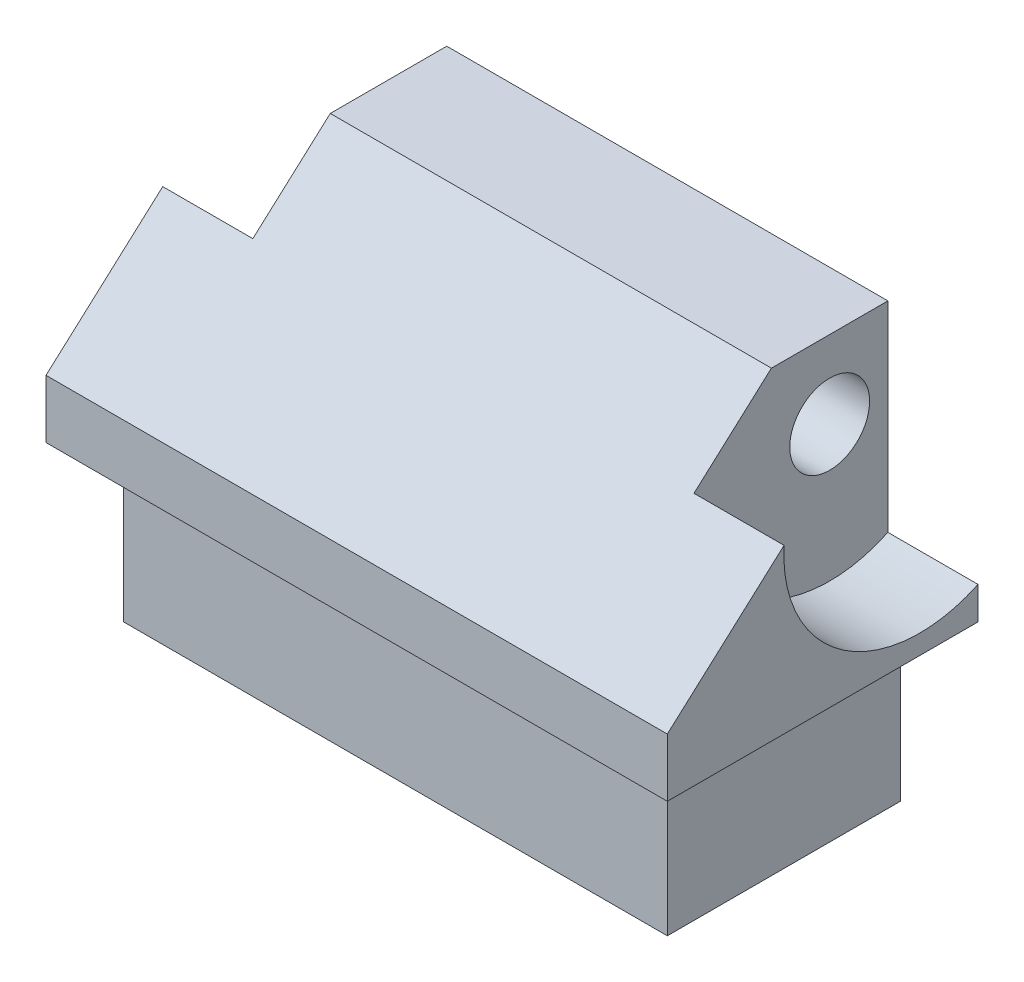
ISO-10303-21;
HEADER;
FILE_DESCRIPTION(('STEP AP214'),'2;1');
FILE_NAME('part.step','',(''),(''),'','','');
FILE_SCHEMA(('AUTOMOTIVE_DESIGN { 1 0 10303 214 1 1 1 1 }'));
ENDSEC;
DATA;
#1=APPLICATION_CONTEXT('core data for automotive mechanical design processes');
#2=APPLICATION_PROTOCOL_DEFINITION('international standard','automotive_design',2000,#1);
#3=PRODUCT_CONTEXT('',#1,'mechanical');
#4=PRODUCT('Part','Part','',(#3));
#5=PRODUCT_RELATED_PRODUCT_CATEGORY('part','',(#4));
#6=PRODUCT_DEFINITION_FORMATION('','',#4);
#7=PRODUCT_DEFINITION_CONTEXT('part definition',#1,'design');
#8=PRODUCT_DEFINITION('design','',#6,#7);
#9=PRODUCT_DEFINITION_SHAPE('','',#8);
#10=(LENGTH_UNIT() NAMED_UNIT(*) SI_UNIT(.MILLI.,.METRE.));
#11=(NAMED_UNIT(*) PLANE_ANGLE_UNIT() SI_UNIT($,.RADIAN.));
#12=(NAMED_UNIT(*) SI_UNIT($,.STERADIAN.) SOLID_ANGLE_UNIT());
#13=UNCERTAINTY_MEASURE_WITH_UNIT(LENGTH_MEASURE(1.E-05),#10,'distance_accuracy_value','');
#14=(GEOMETRIC_REPRESENTATION_CONTEXT(3) GLOBAL_UNCERTAINTY_ASSIGNED_CONTEXT((#13)) GLOBAL_UNIT_ASSIGNED_CONTEXT((#10,
#11,#12)) REPRESENTATION_CONTEXT('',''));
#15=CARTESIAN_POINT('',(0.,0.,0.));
#16=DIRECTION('',(0.,0.,1.));
#17=DIRECTION('',(1.,0.,0.));
#18=AXIS2_PLACEMENT_3D('',#15,#16,#17);
#19=CARTESIAN_POINT('',(25.4,19.05,-3.175));
#20=DIRECTION('',(0.,-1.,0.));
#21=DIRECTION('',(0.,0.,-1.));
#22=AXIS2_PLACEMENT_3D('',#19,#20,#21);
#23=PLANE('',#22);
#24=DIRECTION('',(0.,0.,-1.));
#25=VECTOR('',#24,1.);
#26=CARTESIAN_POINT('',(-18.034,19.05,-3.175));
#27=LINE('',#26,#25);
#28=CARTESIAN_POINT('',(-18.034,19.05,-3.175));
#29=VERTEX_POINT('',#28);
#30=CARTESIAN_POINT('',(-18.034,19.05,-12.7));
#31=VERTEX_POINT('',#30);
#32=EDGE_CURVE('E222',#29,#31,#27,.T.);
#33=ORIENTED_EDGE('',*,*,#32,.F.);
#34=DIRECTION('',(-1.,0.,0.));
#35=VECTOR('',#34,1.);
#36=CARTESIAN_POINT('',(25.4,19.05,-3.175));
#37=LINE('',#36,#35);
#38=CARTESIAN_POINT('',(18.034,19.05,-3.175));
#39=VERTEX_POINT('',#38);
#40=EDGE_CURVE('E159',#39,#29,#37,.T.);
#41=ORIENTED_EDGE('',*,*,#40,.F.);
#42=DIRECTION('',(0.,0.,1.));
#43=VECTOR('',#42,1.);
#44=CARTESIAN_POINT('',(18.034,19.05,-3.175));
#45=LINE('',#44,#43);
#46=CARTESIAN_POINT('',(18.034,19.05,-12.7));
#47=VERTEX_POINT('',#46);
#48=EDGE_CURVE('E56',#47,#39,#45,.T.);
#49=ORIENTED_EDGE('',*,*,#48,.F.);
#50=DIRECTION('',(-1.,0.,0.));
#51=VECTOR('',#50,1.);
#52=CARTESIAN_POINT('',(25.4,19.05,-12.7));
#53=LINE('',#52,#51);
#54=EDGE_CURVE('E161',#47,#31,#53,.T.);
#55=ORIENTED_EDGE('',*,*,#54,.T.);
#56=EDGE_LOOP('',(#33,#41,#49,#55));
#57=FACE_BOUND('',#56,.T.);
#58=ADVANCED_FACE('F34',(#57),#23,.F.);
#59=CARTESIAN_POINT('',(25.4,3.175,-12.7));
#60=DIRECTION('',(0.,0.,1.));
#61=DIRECTION('',(1.,0.,0.));
#62=AXIS2_PLACEMENT_3D('',#59,#60,#61);
#63=PLANE('',#62);
#64=DIRECTION('',(-1.,0.,0.));
#65=VECTOR('',#64,1.);
#66=CARTESIAN_POINT('',(-18.034,2.6597684289654,-12.7));
#67=LINE('',#66,#65);
#68=CARTESIAN_POINT('',(-18.034,2.6597684289654,-12.7));
#69=VERTEX_POINT('',#68);
#70=CARTESIAN_POINT('',(-25.4,2.6597684289654,-12.7));
#71=VERTEX_POINT('',#70);
#72=EDGE_CURVE('E132',#69,#71,#67,.T.);
#73=ORIENTED_EDGE('',*,*,#72,.F.);
#74=DIRECTION('',(0.,-1.,0.));
#75=VECTOR('',#74,1.);
#76=CARTESIAN_POINT('',(-18.034,3.175,-12.7));
#77=LINE('',#76,#75);
#78=EDGE_CURVE('E227',#31,#69,#77,.T.);
#79=ORIENTED_EDGE('',*,*,#78,.F.);
#80=ORIENTED_EDGE('',*,*,#54,.F.);
#81=DIRECTION('',(0.,1.,0.));
#82=VECTOR('',#81,1.);
#83=CARTESIAN_POINT('',(18.034,3.175,-12.7));
#84=LINE('',#83,#82);
#85=CARTESIAN_POINT('',(18.034,2.6597684289654,-12.7));
#86=VERTEX_POINT('',#85);
#87=EDGE_CURVE('E155',#86,#47,#84,.T.);
#88=ORIENTED_EDGE('',*,*,#87,.F.);
#89=DIRECTION('',(1.,0.,0.));
#90=VECTOR('',#89,1.);
#91=CARTESIAN_POINT('',(18.034,2.6597684289654,-12.7));
#92=LINE('',#91,#90);
#93=CARTESIAN_POINT('',(25.4,2.6597684289654,-12.7));
#94=VERTEX_POINT('',#93);
#95=EDGE_CURVE('E150',#86,#94,#92,.T.);
#96=ORIENTED_EDGE('',*,*,#95,.T.);
#97=DIRECTION('',(0.,-1.,0.));
#98=VECTOR('',#97,1.);
#99=CARTESIAN_POINT('',(25.4,3.175,-12.7));
#100=LINE('',#99,#98);
#101=CARTESIAN_POINT('',(25.4,0.,-12.7));
#102=VERTEX_POINT('',#101);
#103=EDGE_CURVE('E176',#94,#102,#100,.T.);
#104=ORIENTED_EDGE('',*,*,#103,.T.);
#105=DIRECTION('',(-1.,0.,0.));
#106=VECTOR('',#105,1.);
#107=CARTESIAN_POINT('',(25.4,0.,-12.7));
#108=LINE('',#107,#106);
#109=CARTESIAN_POINT('',(-25.4,0.,-12.7));
#110=VERTEX_POINT('',#109);
#111=EDGE_CURVE('E171',#102,#110,#108,.T.);
#112=ORIENTED_EDGE('',*,*,#111,.T.);
#113=DIRECTION('',(0.,-1.,0.));
#114=VECTOR('',#113,1.);
#115=CARTESIAN_POINT('',(-25.4,3.175,-12.7));
#116=LINE('',#115,#114);
#117=EDGE_CURVE('E174',#71,#110,#116,.T.);
#118=ORIENTED_EDGE('',*,*,#117,.F.);
#119=EDGE_LOOP('',(#73,#79,#80,#88,#96,#104,#112,#118));
#120=FACE_BOUND('',#119,.T.);
#121=ADVANCED_FACE('F248',(#120),#63,.F.);
#122=CARTESIAN_POINT('',(25.4,4.7625,12.7));
#123=DIRECTION('',(0.,-0.743294146247166,-0.66896473162245));
#124=DIRECTION('',(0.,0.66896473162245,-0.743294146247166));
#125=AXIS2_PLACEMENT_3D('',#122,#123,#124);
#126=PLANE('',#125);
#127=DIRECTION('',(-1.,0.,0.));
#128=VECTOR('',#127,1.);
#129=CARTESIAN_POINT('',(-18.034,13.3522422156945,3.15584198256169));
#130=LINE('',#129,#128);
#131=CARTESIAN_POINT('',(-25.4,13.3522422156945,3.1558419825617));
#132=VERTEX_POINT('',#131);
#133=CARTESIAN_POINT('',(-18.034,13.3522422156945,3.1558419825617));
#134=VERTEX_POINT('',#133);
#135=EDGE_CURVE('E11',#132,#134,#130,.F.);
#136=ORIENTED_EDGE('',*,*,#135,.F.);
#137=DIRECTION('',(0.,-0.66896473162245,0.743294146247166));
#138=VECTOR('',#137,1.);
#139=CARTESIAN_POINT('',(-25.4,4.7625,12.7));
#140=LINE('',#139,#138);
#141=CARTESIAN_POINT('',(-25.4,4.7625,12.7));
#142=VERTEX_POINT('',#141);
#143=EDGE_CURVE('E140',#132,#142,#140,.T.);
#144=ORIENTED_EDGE('',*,*,#143,.T.);
#145=DIRECTION('',(-1.,0.,0.));
#146=VECTOR('',#145,1.);
#147=CARTESIAN_POINT('',(25.4,4.7625,12.7));
#148=LINE('',#147,#146);
#149=CARTESIAN_POINT('',(25.4,4.7625,12.7));
#150=VERTEX_POINT('',#149);
#151=EDGE_CURVE('E152',#150,#142,#148,.T.);
#152=ORIENTED_EDGE('',*,*,#151,.F.);
#153=DIRECTION('',(0.,-0.66896473162245,0.743294146247166));
#154=VECTOR('',#153,1.);
#155=CARTESIAN_POINT('',(25.4,4.7625,12.7));
#156=LINE('',#155,#154);
#157=CARTESIAN_POINT('',(25.4,13.3522422156945,3.1558419825617));
#158=VERTEX_POINT('',#157);
#159=EDGE_CURVE('E149',#158,#150,#156,.T.);
#160=ORIENTED_EDGE('',*,*,#159,.F.);
#161=DIRECTION('',(1.,0.,0.));
#162=VECTOR('',#161,1.);
#163=CARTESIAN_POINT('',(18.034,13.3522422156945,3.15584198256169));
#164=LINE('',#163,#162);
#165=CARTESIAN_POINT('',(18.034,13.3522422156945,3.1558419825617));
#166=VERTEX_POINT('',#165);
#167=EDGE_CURVE('E42',#158,#166,#164,.F.);
#168=ORIENTED_EDGE('',*,*,#167,.T.);
#169=DIRECTION('',(0.,-0.66896473162245,0.743294146247166));
#170=VECTOR('',#169,1.);
#171=CARTESIAN_POINT('',(18.034,4.7625,12.7));
#172=LINE('',#171,#170);
#173=EDGE_CURVE('E210',#39,#166,#172,.T.);
#174=ORIENTED_EDGE('',*,*,#173,.F.);
#175=ORIENTED_EDGE('',*,*,#40,.T.);
#176=DIRECTION('',(0.,0.66896473162245,-0.743294146247166));
#177=VECTOR('',#176,1.);
#178=CARTESIAN_POINT('',(-18.034,4.7625,12.7));
#179=LINE('',#178,#177);
#180=EDGE_CURVE('E143',#134,#29,#179,.T.);
#181=ORIENTED_EDGE('',*,*,#180,.F.);
#182=EDGE_LOOP('',(#136,#144,#152,#160,#168,#174,#175,#181));
#183=FACE_BOUND('',#182,.T.);
#184=ADVANCED_FACE('F138',(#183),#126,.F.);
#185=CARTESIAN_POINT('',(-25.4,12.7,-7.9375));
#186=DIRECTION('',(1.,0.,0.));
#187=DIRECTION('',(0.,0.,-1.));
#188=AXIS2_PLACEMENT_3D('',#185,#186,#187);
#189=CYLINDRICAL_SURFACE('',#188,3.2639);
#190=CARTESIAN_POINT('',(18.034,12.7,-7.9375));
#191=DIRECTION('',(1.,0.,0.));
#192=DIRECTION('',(0.,0.,-1.));
#193=AXIS2_PLACEMENT_3D('',#190,#191,#192);
#194=CIRCLE('',#193,3.2639);
#195=CARTESIAN_POINT('',(18.034,12.7,-11.2014));
#196=VERTEX_POINT('',#195);
#197=EDGE_CURVE('E230',#196,#196,#194,.T.);
#198=CARTESIAN_POINT('',(-18.034,12.7,-7.9375));
#199=DIRECTION('',(-1.,0.,0.));
#200=DIRECTION('',(0.,0.,1.));
#201=AXIS2_PLACEMENT_3D('',#198,#199,#200);
#202=CIRCLE('',#201,3.2639);
#203=CARTESIAN_POINT('',(-18.034,12.7,-11.2014));
#204=VERTEX_POINT('',#203);
#205=EDGE_CURVE('E218',#204,#204,#202,.F.);
#206=CARTESIAN_POINT('',(18.034,12.7,-11.2014));
#207=CARTESIAN_POINT('',(17.6582916666667,12.7,-11.2014));
#208=CARTESIAN_POINT('',(17.2825833333333,12.7,-11.2014));
#209=CARTESIAN_POINT('',(16.5311666666667,12.7,-11.2014));
#210=CARTESIAN_POINT('',(16.1554583333333,12.7,-11.2014));
#211=CARTESIAN_POINT('',(15.4040416666667,12.7,-11.2014));
#212=CARTESIAN_POINT('',(15.0283333333333,12.7,-11.2014));
#213=CARTESIAN_POINT('',(14.2769166666667,12.7,-11.2014));
#214=CARTESIAN_POINT('',(13.9012083333333,12.7,-11.2014));
#215=CARTESIAN_POINT('',(13.1497916666667,12.7,-11.2014));
#216=CARTESIAN_POINT('',(12.7740833333333,12.7,-11.2014));
#217=CARTESIAN_POINT('',(12.0226666666667,12.7,-11.2014));
#218=CARTESIAN_POINT('',(11.6469583333333,12.7,-11.2014));
#219=CARTESIAN_POINT('',(10.8955416666667,12.7,-11.2014));
#220=CARTESIAN_POINT('',(10.5198333333333,12.7,-11.2014));
#221=CARTESIAN_POINT('',(9.76841666666666,12.7,-11.2014));
#222=CARTESIAN_POINT('',(9.39270833333333,12.7,-11.2014));
#223=CARTESIAN_POINT('',(8.64129166666666,12.7,-11.2014));
#224=CARTESIAN_POINT('',(8.26558333333333,12.7,-11.2014));
#225=CARTESIAN_POINT('',(7.51416666666666,12.7,-11.2014));
#226=CARTESIAN_POINT('',(7.13845833333333,12.7,-11.2014));
#227=CARTESIAN_POINT('',(6.38704166666666,12.7,-11.2014));
#228=CARTESIAN_POINT('',(6.01133333333333,12.7,-11.2014));
#229=CARTESIAN_POINT('',(5.25991666666666,12.7,-11.2014));
#230=CARTESIAN_POINT('',(4.88420833333333,12.7,-11.2014));
#231=CARTESIAN_POINT('',(4.13279166666666,12.7,-11.2014));
#232=CARTESIAN_POINT('',(3.75708333333333,12.7,-11.2014));
#233=CARTESIAN_POINT('',(3.00566666666666,12.7,-11.2014));
#234=CARTESIAN_POINT('',(2.62995833333333,12.7,-11.2014));
#235=CARTESIAN_POINT('',(1.87854166666666,12.7,-11.2014));
#236=CARTESIAN_POINT('',(1.50283333333333,12.7,-11.2014));
#237=CARTESIAN_POINT('',(0.751416666666663,12.7,-11.2014));
#238=CARTESIAN_POINT('',(0.37570833333333,12.7,-11.2014));
#239=CARTESIAN_POINT('',(-0.375708333333337,12.7,-11.2014));
#240=CARTESIAN_POINT('',(-0.75141666666667,12.7,-11.2014));
#241=CARTESIAN_POINT('',(-1.50283333333334,12.7,-11.2014));
#242=CARTESIAN_POINT('',(-1.87854166666667,12.7,-11.2014));
#243=CARTESIAN_POINT('',(-2.62995833333334,12.7,-11.2014));
#244=CARTESIAN_POINT('',(-3.00566666666667,12.7,-11.2014));
#245=CARTESIAN_POINT('',(-3.75708333333334,12.7,-11.2014));
#246=CARTESIAN_POINT('',(-4.13279166666667,12.7,-11.2014));
#247=CARTESIAN_POINT('',(-4.88420833333334,12.7,-11.2014));
#248=CARTESIAN_POINT('',(-5.25991666666667,12.7,-11.2014));
#249=CARTESIAN_POINT('',(-6.01133333333334,12.7,-11.2014));
#250=CARTESIAN_POINT('',(-6.38704166666667,12.7,-11.2014));
#251=CARTESIAN_POINT('',(-7.13845833333334,12.7,-11.2014));
#252=CARTESIAN_POINT('',(-7.51416666666667,12.7,-11.2014));
#253=CARTESIAN_POINT('',(-8.26558333333334,12.7,-11.2014));
#254=CARTESIAN_POINT('',(-8.64129166666667,12.7,-11.2014));
#255=CARTESIAN_POINT('',(-9.39270833333334,12.7,-11.2014));
#256=CARTESIAN_POINT('',(-9.76841666666667,12.7,-11.2014));
#257=CARTESIAN_POINT('',(-10.5198333333333,12.7,-11.2014));
#258=CARTESIAN_POINT('',(-10.8955416666667,12.7,-11.2014));
#259=CARTESIAN_POINT('',(-11.6469583333333,12.7,-11.2014));
#260=CARTESIAN_POINT('',(-12.0226666666667,12.7,-11.2014));
#261=CARTESIAN_POINT('',(-12.7740833333333,12.7,-11.2014));
#262=CARTESIAN_POINT('',(-13.1497916666667,12.7,-11.2014));
#263=CARTESIAN_POINT('',(-13.9012083333333,12.7,-11.2014));
#264=CARTESIAN_POINT('',(-14.2769166666667,12.7,-11.2014));
#265=CARTESIAN_POINT('',(-15.0283333333333,12.7,-11.2014));
#266=CARTESIAN_POINT('',(-15.4040416666667,12.7,-11.2014));
#267=CARTESIAN_POINT('',(-16.1554583333333,12.7,-11.2014));
#268=CARTESIAN_POINT('',(-16.5311666666667,12.7,-11.2014));
#269=CARTESIAN_POINT('',(-17.2825833333333,12.7,-11.2014));
#270=CARTESIAN_POINT('',(-17.6582916666667,12.7,-11.2014));
#271=CARTESIAN_POINT('',(-18.034,12.7,-11.2014));
#272=B_SPLINE_CURVE_WITH_KNOTS('',3,(#206,#207,#208,#209,#210,#211,#212,#213,#214,#215,#216,
#217,#218,#219,#220,#221,#222,#223,#224,#225,#226,#227,#228,#229,#230,#231,#232,#233,#234,#235,
#236,#237,#238,#239,#240,#241,#242,#243,#244,#245,#246,#247,#248,#249,#250,#251,#252,#253,#254,
#255,#256,#257,#258,#259,#260,#261,#262,#263,#264,#265,#266,#267,#268,#269,#270,#271),
.UNSPECIFIED.,.F.,.F.,(4,2,2,2,2,2,2,2,2,2,2,2,2,2,2,2,2,2,2,2,2,2,2,2,2,2,2,2,2,2,2,2,4),(0.,
1.127125,2.25425,3.381375,4.5085,5.635625,6.76275,7.889875,9.017,10.144125,11.27125,12.398375,
13.5255,14.652625,15.77975,16.906875,18.034,19.161125,20.28825,21.415375,22.5425,23.669625,
24.79675,25.923875,27.051,28.178125,29.30525,30.432375,31.5595,32.686625,33.81375,34.940875,
36.068),.UNSPECIFIED.);
#273=EDGE_CURVE('BSEAM330',#196,#204,#272,.T.);
#274=ORIENTED_EDGE('',*,*,#197,.T.);
#275=ORIENTED_EDGE('',*,*,#205,.F.);
#276=ORIENTED_EDGE('',*,*,#273,.T.);
#277=ORIENTED_EDGE('',*,*,#273,.F.);
#278=EDGE_LOOP('',(#274,#276,#275,#277));
#279=FACE_BOUND('',#278,.T.);
#280=ADVANCED_FACE('F330',(#279),#189,.F.);
#281=CARTESIAN_POINT('',(-22.225,-12.7,9.52500000000001));
#282=DIRECTION('',(-1.,0.,0.));
#283=DIRECTION('',(0.,0.,1.));
#284=AXIS2_PLACEMENT_3D('',#281,#282,#283);
#285=PLANE('',#284);
#286=DIRECTION('',(0.,0.,1.));
#287=VECTOR('',#286,1.);
#288=CARTESIAN_POINT('',(-22.225,0.,9.52500000000001));
#289=LINE('',#288,#287);
#290=CARTESIAN_POINT('',(-22.225,0.,-9.52499999999999));
#291=VERTEX_POINT('',#290);
#292=CARTESIAN_POINT('',(-22.225,0.,9.52500000000001));
#293=VERTEX_POINT('',#292);
#294=EDGE_CURVE('E182',#291,#293,#289,.T.);
#295=ORIENTED_EDGE('',*,*,#294,.F.);
#296=DIRECTION('',(0.,1.,0.));
#297=VECTOR('',#296,1.);
#298=CARTESIAN_POINT('',(-22.225,-12.7,-9.52499999999999));
#299=LINE('',#298,#297);
#300=CARTESIAN_POINT('',(-22.225,-12.7,-9.52499999999999));
#301=VERTEX_POINT('',#300);
#302=EDGE_CURVE('E207',#301,#291,#299,.T.);
#303=ORIENTED_EDGE('',*,*,#302,.F.);
#304=DIRECTION('',(0.,0.,1.));
#305=VECTOR('',#304,1.);
#306=CARTESIAN_POINT('',(-22.225,-12.7,9.52500000000001));
#307=LINE('',#306,#305);
#308=CARTESIAN_POINT('',(-22.225,-12.7,9.52500000000001));
#309=VERTEX_POINT('',#308);
#310=EDGE_CURVE('E183',#301,#309,#307,.T.);
#311=ORIENTED_EDGE('',*,*,#310,.T.);
#312=DIRECTION('',(0.,1.,0.));
#313=VECTOR('',#312,1.);
#314=CARTESIAN_POINT('',(-22.225,-12.7,9.52500000000001));
#315=LINE('',#314,#313);
#316=EDGE_CURVE('E196',#309,#293,#315,.T.);
#317=ORIENTED_EDGE('',*,*,#316,.T.);
#318=EDGE_LOOP('',(#295,#303,#311,#317));
#319=FACE_BOUND('',#318,.T.);
#320=ADVANCED_FACE('F36',(#319),#285,.T.);
#321=CARTESIAN_POINT('',(22.225,-12.7,-9.525));
#322=DIRECTION('',(0.,0.,-1.));
#323=DIRECTION('',(-1.,0.,0.));
#324=AXIS2_PLACEMENT_3D('',#321,#322,#323);
#325=PLANE('',#324);
#326=DIRECTION('',(-1.,0.,0.));
#327=VECTOR('',#326,1.);
#328=CARTESIAN_POINT('',(22.225,0.,-9.525));
#329=LINE('',#328,#327);
#330=CARTESIAN_POINT('',(22.225,0.,-9.525));
#331=VERTEX_POINT('',#330);
#332=EDGE_CURVE('E187',#331,#291,#329,.T.);
#333=ORIENTED_EDGE('',*,*,#332,.F.);
#334=DIRECTION('',(0.,1.,0.));
#335=VECTOR('',#334,1.);
#336=CARTESIAN_POINT('',(22.225,-12.7,-9.525));
#337=LINE('',#336,#335);
#338=CARTESIAN_POINT('',(22.225,-12.7,-9.525));
#339=VERTEX_POINT('',#338);
#340=EDGE_CURVE('E211',#339,#331,#337,.T.);
#341=ORIENTED_EDGE('',*,*,#340,.F.);
#342=DIRECTION('',(-1.,0.,0.));
#343=VECTOR('',#342,1.);
#344=CARTESIAN_POINT('',(22.225,-12.7,-9.525));
#345=LINE('',#344,#343);
#346=EDGE_CURVE('E193',#339,#301,#345,.T.);
#347=ORIENTED_EDGE('',*,*,#346,.T.);
#348=ORIENTED_EDGE('',*,*,#302,.T.);
#349=EDGE_LOOP('',(#333,#341,#347,#348));
#350=FACE_BOUND('',#349,.T.);
#351=ADVANCED_FACE('F291',(#350),#325,.T.);
#352=CARTESIAN_POINT('',(22.225,-12.7,9.525));
#353=DIRECTION('',(1.,0.,0.));
#354=DIRECTION('',(0.,0.,-1.));
#355=AXIS2_PLACEMENT_3D('',#352,#353,#354);
#356=PLANE('',#355);
#357=DIRECTION('',(0.,0.,-1.));
#358=VECTOR('',#357,1.);
#359=CARTESIAN_POINT('',(22.225,0.,9.525));
#360=LINE('',#359,#358);
#361=CARTESIAN_POINT('',(22.225,0.,9.525));
#362=VERTEX_POINT('',#361);
#363=EDGE_CURVE('E202',#362,#331,#360,.T.);
#364=ORIENTED_EDGE('',*,*,#363,.F.);
#365=DIRECTION('',(0.,1.,0.));
#366=VECTOR('',#365,1.);
#367=CARTESIAN_POINT('',(22.225,-12.7,9.525));
#368=LINE('',#367,#366);
#369=CARTESIAN_POINT('',(22.225,-12.7,9.525));
#370=VERTEX_POINT('',#369);
#371=EDGE_CURVE('E213',#370,#362,#368,.T.);
#372=ORIENTED_EDGE('',*,*,#371,.F.);
#373=DIRECTION('',(0.,0.,-1.));
#374=VECTOR('',#373,1.);
#375=CARTESIAN_POINT('',(22.225,-12.7,9.525));
#376=LINE('',#375,#374);
#377=EDGE_CURVE('E190',#370,#339,#376,.T.);
#378=ORIENTED_EDGE('',*,*,#377,.T.);
#379=ORIENTED_EDGE('',*,*,#340,.T.);
#380=EDGE_LOOP('',(#364,#372,#378,#379));
#381=FACE_BOUND('',#380,.T.);
#382=ADVANCED_FACE('F302',(#381),#356,.T.);
#383=CARTESIAN_POINT('',(22.225,-12.7,9.525));
#384=DIRECTION('',(0.,0.,1.));
#385=DIRECTION('',(1.,0.,0.));
#386=AXIS2_PLACEMENT_3D('',#383,#384,#385);
#387=PLANE('',#386);
#388=DIRECTION('',(1.,0.,0.));
#389=VECTOR('',#388,1.);
#390=CARTESIAN_POINT('',(22.225,0.,9.525));
#391=LINE('',#390,#389);
#392=EDGE_CURVE('E199',#293,#362,#391,.T.);
#393=ORIENTED_EDGE('',*,*,#392,.F.);
#394=ORIENTED_EDGE('',*,*,#316,.F.);
#395=DIRECTION('',(1.,0.,0.));
#396=VECTOR('',#395,1.);
#397=CARTESIAN_POINT('',(22.225,-12.7,9.525));
#398=LINE('',#397,#396);
#399=EDGE_CURVE('E186',#309,#370,#398,.T.);
#400=ORIENTED_EDGE('',*,*,#399,.T.);
#401=ORIENTED_EDGE('',*,*,#371,.T.);
#402=EDGE_LOOP('',(#393,#394,#400,#401));
#403=FACE_BOUND('',#402,.T.);
#404=ADVANCED_FACE('F300',(#403),#387,.T.);
#405=CARTESIAN_POINT('',(0.,-12.7,0.));
#406=DIRECTION('',(0.,1.,0.));
#407=DIRECTION('',(0.,0.,1.));
#408=AXIS2_PLACEMENT_3D('',#405,#406,#407);
#409=PLANE('',#408);
#410=ORIENTED_EDGE('',*,*,#310,.F.);
#411=ORIENTED_EDGE('',*,*,#346,.F.);
#412=ORIENTED_EDGE('',*,*,#377,.F.);
#413=ORIENTED_EDGE('',*,*,#399,.F.);
#414=EDGE_LOOP('',(#410,#411,#412,#413));
#415=FACE_BOUND('',#414,.T.);
#416=ADVANCED_FACE('F272',(#415),#409,.F.);
#417=CARTESIAN_POINT('',(-25.4,3.175,-12.7));
#418=DIRECTION('',(1.,0.,0.));
#419=DIRECTION('',(0.,0.,-1.));
#420=AXIS2_PLACEMENT_3D('',#417,#418,#419);
#421=PLANE('',#420);
#422=CARTESIAN_POINT('',(-25.4,12.7,-7.9375));
#423=DIRECTION('',(1.,0.,0.));
#424=DIRECTION('',(0.,0.,-1.));
#425=AXIS2_PLACEMENT_3D('',#422,#423,#424);
#426=CIRCLE('',#425,11.1125);
#427=EDGE_CURVE('E127',#132,#71,#426,.T.);
#428=ORIENTED_EDGE('',*,*,#427,.T.);
#429=ORIENTED_EDGE('',*,*,#117,.T.);
#430=DIRECTION('',(0.,0.,1.));
#431=VECTOR('',#430,1.);
#432=CARTESIAN_POINT('',(-25.4,0.,-12.7));
#433=LINE('',#432,#431);
#434=CARTESIAN_POINT('',(-25.4,0.,12.7));
#435=VERTEX_POINT('',#434);
#436=EDGE_CURVE('E164',#110,#435,#433,.T.);
#437=ORIENTED_EDGE('',*,*,#436,.T.);
#438=DIRECTION('',(0.,-1.,0.));
#439=VECTOR('',#438,1.);
#440=CARTESIAN_POINT('',(-25.4,3.175,12.7));
#441=LINE('',#440,#439);
#442=EDGE_CURVE('E147',#142,#435,#441,.T.);
#443=ORIENTED_EDGE('',*,*,#442,.F.);
#444=ORIENTED_EDGE('',*,*,#143,.F.);
#445=EDGE_LOOP('',(#428,#429,#437,#443,#444));
#446=FACE_BOUND('',#445,.T.);
#447=ADVANCED_FACE('F144',(#446),#421,.F.);
#448=CARTESIAN_POINT('',(25.4,3.175,12.7));
#449=DIRECTION('',(0.,0.,-1.));
#450=DIRECTION('',(-1.,0.,0.));
#451=AXIS2_PLACEMENT_3D('',#448,#449,#450);
#452=PLANE('',#451);
#453=DIRECTION('',(1.,0.,0.));
#454=VECTOR('',#453,1.);
#455=CARTESIAN_POINT('',(25.4,0.,12.7));
#456=LINE('',#455,#454);
#457=CARTESIAN_POINT('',(25.4,0.,12.7));
#458=VERTEX_POINT('',#457);
#459=EDGE_CURVE('E166',#435,#458,#456,.T.);
#460=ORIENTED_EDGE('',*,*,#459,.T.);
#461=DIRECTION('',(0.,-1.,0.));
#462=VECTOR('',#461,1.);
#463=CARTESIAN_POINT('',(25.4,3.175,12.7));
#464=LINE('',#463,#462);
#465=EDGE_CURVE('E178',#150,#458,#464,.T.);
#466=ORIENTED_EDGE('',*,*,#465,.F.);
#467=ORIENTED_EDGE('',*,*,#151,.T.);
#468=ORIENTED_EDGE('',*,*,#442,.T.);
#469=EDGE_LOOP('',(#460,#466,#467,#468));
#470=FACE_BOUND('',#469,.T.);
#471=ADVANCED_FACE('F264',(#470),#452,.F.);
#472=CARTESIAN_POINT('',(25.4,3.175,-12.7));
#473=DIRECTION('',(-1.,0.,0.));
#474=DIRECTION('',(0.,0.,1.));
#475=AXIS2_PLACEMENT_3D('',#472,#473,#474);
#476=PLANE('',#475);
#477=ORIENTED_EDGE('',*,*,#103,.F.);
#478=CARTESIAN_POINT('',(25.4,12.7,-7.9375));
#479=DIRECTION('',(1.,0.,0.));
#480=DIRECTION('',(0.,0.,-1.));
#481=AXIS2_PLACEMENT_3D('',#478,#479,#480);
#482=CIRCLE('',#481,11.1125);
#483=EDGE_CURVE('E233',#158,#94,#482,.T.);
#484=ORIENTED_EDGE('',*,*,#483,.F.);
#485=ORIENTED_EDGE('',*,*,#159,.T.);
#486=ORIENTED_EDGE('',*,*,#465,.T.);
#487=DIRECTION('',(0.,0.,-1.));
#488=VECTOR('',#487,1.);
#489=CARTESIAN_POINT('',(25.4,0.,-12.7));
#490=LINE('',#489,#488);
#491=EDGE_CURVE('E168',#458,#102,#490,.T.);
#492=ORIENTED_EDGE('',*,*,#491,.T.);
#493=EDGE_LOOP('',(#477,#484,#485,#486,#492));
#494=FACE_BOUND('',#493,.T.);
#495=ADVANCED_FACE('F256',(#494),#476,.F.);
#496=CARTESIAN_POINT('',(0.,0.,0.));
#497=DIRECTION('',(0.,-1.,0.));
#498=DIRECTION('',(0.,0.,-1.));
#499=AXIS2_PLACEMENT_3D('',#496,#497,#498);
#500=PLANE('',#499);
#501=ORIENTED_EDGE('',*,*,#332,.T.);
#502=ORIENTED_EDGE('',*,*,#294,.T.);
#503=ORIENTED_EDGE('',*,*,#392,.T.);
#504=ORIENTED_EDGE('',*,*,#363,.T.);
#505=EDGE_LOOP('',(#501,#502,#503,#504));
#506=FACE_BOUND('',#505,.T.);
#507=ORIENTED_EDGE('',*,*,#436,.F.);
#508=ORIENTED_EDGE('',*,*,#111,.F.);
#509=ORIENTED_EDGE('',*,*,#491,.F.);
#510=ORIENTED_EDGE('',*,*,#459,.F.);
#511=EDGE_LOOP('',(#507,#508,#509,#510));
#512=FACE_BOUND('',#511,.T.);
#513=ADVANCED_FACE('F262',(#506,#512),#500,.T.);
#514=CARTESIAN_POINT('',(18.034,12.7,-7.9375));
#515=DIRECTION('',(1.,0.,0.));
#516=DIRECTION('',(0.,0.,-1.));
#517=AXIS2_PLACEMENT_3D('',#514,#515,#516);
#518=CYLINDRICAL_SURFACE('',#517,11.1125);
#519=CARTESIAN_POINT('',(18.034,12.7,-7.9375));
#520=DIRECTION('',(1.,0.,0.));
#521=DIRECTION('',(0.,0.,-1.));
#522=AXIS2_PLACEMENT_3D('',#519,#520,#521);
#523=CIRCLE('',#522,11.1125);
#524=EDGE_CURVE('E234',#166,#86,#523,.T.);
#525=ORIENTED_EDGE('',*,*,#524,.F.);
#526=ORIENTED_EDGE('',*,*,#167,.F.);
#527=ORIENTED_EDGE('',*,*,#483,.T.);
#528=ORIENTED_EDGE('',*,*,#95,.F.);
#529=EDGE_LOOP('',(#525,#526,#527,#528));
#530=FACE_BOUND('',#529,.T.);
#531=ADVANCED_FACE('F252',(#530),#518,.F.);
#532=CARTESIAN_POINT('',(18.034,12.7,-7.9375));
#533=DIRECTION('',(1.,0.,0.));
#534=DIRECTION('',(0.,0.,-1.));
#535=AXIS2_PLACEMENT_3D('',#532,#533,#534);
#536=PLANE('',#535);
#537=ORIENTED_EDGE('',*,*,#197,.F.);
#538=EDGE_LOOP('',(#537));
#539=FACE_BOUND('',#538,.T.);
#540=ORIENTED_EDGE('',*,*,#87,.T.);
#541=ORIENTED_EDGE('',*,*,#48,.T.);
#542=ORIENTED_EDGE('',*,*,#173,.T.);
#543=ORIENTED_EDGE('',*,*,#524,.T.);
#544=EDGE_LOOP('',(#540,#541,#542,#543));
#545=FACE_BOUND('',#544,.T.);
#546=ADVANCED_FACE('F240',(#539,#545),#536,.T.);
#547=CARTESIAN_POINT('',(-18.034,12.7,-7.9375));
#548=DIRECTION('',(-1.,0.,0.));
#549=DIRECTION('',(0.,0.,1.));
#550=AXIS2_PLACEMENT_3D('',#547,#548,#549);
#551=CYLINDRICAL_SURFACE('',#550,11.1125);
#552=ORIENTED_EDGE('',*,*,#72,.T.);
#553=ORIENTED_EDGE('',*,*,#427,.F.);
#554=ORIENTED_EDGE('',*,*,#135,.T.);
#555=CARTESIAN_POINT('',(-18.034,12.7,-7.9375));
#556=DIRECTION('',(1.,0.,0.));
#557=DIRECTION('',(0.,0.,-1.));
#558=AXIS2_PLACEMENT_3D('',#555,#556,#557);
#559=CIRCLE('',#558,11.1125);
#560=EDGE_CURVE('E49',#134,#69,#559,.T.);
#561=ORIENTED_EDGE('',*,*,#560,.T.);
#562=EDGE_LOOP('',(#552,#553,#554,#561));
#563=FACE_BOUND('',#562,.T.);
#564=ADVANCED_FACE('F129',(#563),#551,.F.);
#565=CARTESIAN_POINT('',(-18.034,12.7,-7.9375));
#566=DIRECTION('',(-1.,0.,0.));
#567=DIRECTION('',(0.,0.,-1.));
#568=AXIS2_PLACEMENT_3D('',#565,#566,#567);
#569=PLANE('',#568);
#570=ORIENTED_EDGE('',*,*,#205,.T.);
#571=EDGE_LOOP('',(#570));
#572=FACE_BOUND('',#571,.T.);
#573=ORIENTED_EDGE('',*,*,#78,.T.);
#574=ORIENTED_EDGE('',*,*,#560,.F.);
#575=ORIENTED_EDGE('',*,*,#180,.T.);
#576=ORIENTED_EDGE('',*,*,#32,.T.);
#577=EDGE_LOOP('',(#573,#574,#575,#576));
#578=FACE_BOUND('',#577,.T.);
#579=ADVANCED_FACE('F249',(#572,#578),#569,.T.);
#580=CLOSED_SHELL('',(#58,#121,#184,#280,#320,#351,#382,#404,#416,#447,#471,#495,#513,#531,#546,
#564,#579));
#581=MANIFOLD_SOLID_BREP('B2',#580);
#582=ADVANCED_BREP_SHAPE_REPRESENTATION('',(#18,#581),#14);
#583=SHAPE_DEFINITION_REPRESENTATION(#9,#582);
ENDSEC;
END-ISO-10303-21;
